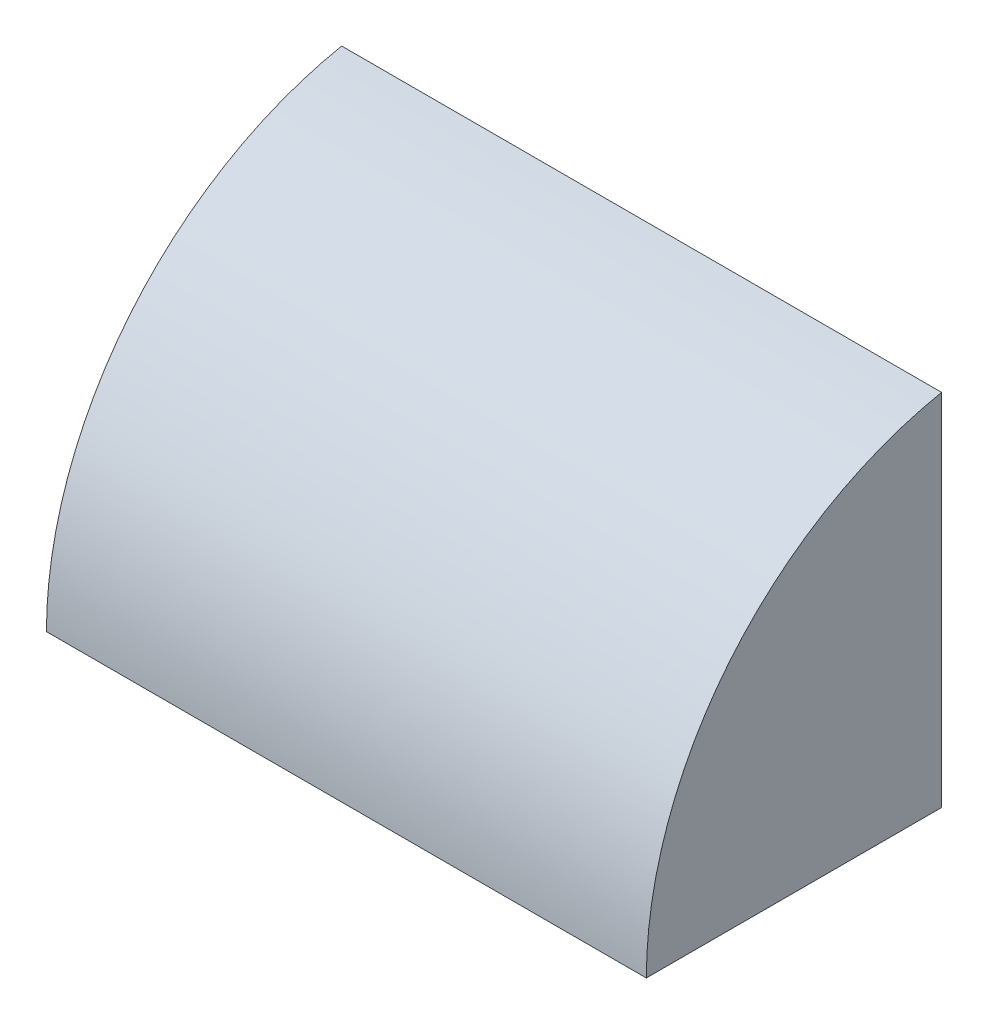
ISO-10303-21;
HEADER;
FILE_DESCRIPTION(('STEP AP214'),'2;1');
FILE_NAME('part.step','',(''),(''),'','','');
FILE_SCHEMA(('AUTOMOTIVE_DESIGN { 1 0 10303 214 1 1 1 1 }'));
ENDSEC;
DATA;
#1=APPLICATION_CONTEXT('core data for automotive mechanical design processes');
#2=APPLICATION_PROTOCOL_DEFINITION('international standard','automotive_design',2000,#1);
#3=PRODUCT_CONTEXT('',#1,'mechanical');
#4=PRODUCT('Part','Part','',(#3));
#5=PRODUCT_RELATED_PRODUCT_CATEGORY('part','',(#4));
#6=PRODUCT_DEFINITION_FORMATION('','',#4);
#7=PRODUCT_DEFINITION_CONTEXT('part definition',#1,'design');
#8=PRODUCT_DEFINITION('design','',#6,#7);
#9=PRODUCT_DEFINITION_SHAPE('','',#8);
#10=(LENGTH_UNIT() NAMED_UNIT(*) SI_UNIT(.MILLI.,.METRE.));
#11=(NAMED_UNIT(*) PLANE_ANGLE_UNIT() SI_UNIT($,.RADIAN.));
#12=(NAMED_UNIT(*) SI_UNIT($,.STERADIAN.) SOLID_ANGLE_UNIT());
#13=UNCERTAINTY_MEASURE_WITH_UNIT(LENGTH_MEASURE(1.E-05),#10,'distance_accuracy_value','');
#14=(GEOMETRIC_REPRESENTATION_CONTEXT(3) GLOBAL_UNCERTAINTY_ASSIGNED_CONTEXT((#13)) GLOBAL_UNIT_ASSIGNED_CONTEXT((#10,
#11,#12)) REPRESENTATION_CONTEXT('',''));
#15=CARTESIAN_POINT('',(0.,0.,0.));
#16=DIRECTION('',(0.,0.,1.));
#17=DIRECTION('',(1.,0.,0.));
#18=AXIS2_PLACEMENT_3D('',#15,#16,#17);
#19=CARTESIAN_POINT('',(-15.85,0.,0.));
#20=DIRECTION('',(0.,-1.,0.));
#21=DIRECTION('',(0.,0.,-1.));
#22=AXIS2_PLACEMENT_3D('',#19,#20,#21);
#23=PLANE('',#22);
#24=DIRECTION('',(0.,0.,-1.));
#25=VECTOR('',#24,1.);
#26=CARTESIAN_POINT('',(0.,0.,0.));
#27=LINE('',#26,#25);
#28=CARTESIAN_POINT('',(0.,0.,7.8));
#29=VERTEX_POINT('',#28);
#30=CARTESIAN_POINT('',(0.,0.,0.));
#31=VERTEX_POINT('',#30);
#32=EDGE_CURVE('E133',#29,#31,#27,.T.);
#33=ORIENTED_EDGE('',*,*,#32,.F.);
#34=DIRECTION('',(1.,0.,0.));
#35=VECTOR('',#34,1.);
#36=CARTESIAN_POINT('',(-15.85,0.,7.8));
#37=LINE('',#36,#35);
#38=CARTESIAN_POINT('',(-15.85,0.,7.8));
#39=VERTEX_POINT('',#38);
#40=EDGE_CURVE('E37',#39,#29,#37,.T.);
#41=ORIENTED_EDGE('',*,*,#40,.F.);
#42=DIRECTION('',(0.,0.,-1.));
#43=VECTOR('',#42,1.);
#44=CARTESIAN_POINT('',(-15.85,0.,0.));
#45=LINE('',#44,#43);
#46=CARTESIAN_POINT('',(-15.85,0.,0.));
#47=VERTEX_POINT('',#46);
#48=EDGE_CURVE('E126',#39,#47,#45,.T.);
#49=ORIENTED_EDGE('',*,*,#48,.T.);
#50=DIRECTION('',(1.,0.,0.));
#51=VECTOR('',#50,1.);
#52=CARTESIAN_POINT('',(-15.85,0.,0.));
#53=LINE('',#52,#51);
#54=EDGE_CURVE('E42',#47,#31,#53,.T.);
#55=ORIENTED_EDGE('',*,*,#54,.T.);
#56=EDGE_LOOP('',(#33,#41,#49,#55));
#57=FACE_BOUND('',#56,.T.);
#58=DIRECTION('',(1.,0.,0.));
#59=VECTOR('',#58,1.);
#60=CARTESIAN_POINT('',(-14.35,0.,6.3));
#61=LINE('',#60,#59);
#62=CARTESIAN_POINT('',(-14.35,0.,6.3));
#63=VERTEX_POINT('',#62);
#64=CARTESIAN_POINT('',(-1.5,0.,6.3));
#65=VERTEX_POINT('',#64);
#66=EDGE_CURVE('E107',#63,#65,#61,.T.);
#67=ORIENTED_EDGE('',*,*,#66,.T.);
#68=DIRECTION('',(0.,0.,-1.));
#69=VECTOR('',#68,1.);
#70=CARTESIAN_POINT('',(-1.5,0.,0.));
#71=LINE('',#70,#69);
#72=CARTESIAN_POINT('',(-1.5,0.,1.5));
#73=VERTEX_POINT('',#72);
#74=EDGE_CURVE('E120',#65,#73,#71,.T.);
#75=ORIENTED_EDGE('',*,*,#74,.T.);
#76=DIRECTION('',(1.,0.,0.));
#77=VECTOR('',#76,1.);
#78=CARTESIAN_POINT('',(-15.85,0.,1.5));
#79=LINE('',#78,#77);
#80=CARTESIAN_POINT('',(-14.35,0.,1.5));
#81=VERTEX_POINT('',#80);
#82=EDGE_CURVE('E101',#81,#73,#79,.T.);
#83=ORIENTED_EDGE('',*,*,#82,.F.);
#84=DIRECTION('',(0.,0.,-1.));
#85=VECTOR('',#84,1.);
#86=CARTESIAN_POINT('',(-14.35,0.,0.));
#87=LINE('',#86,#85);
#88=EDGE_CURVE('E110',#63,#81,#87,.T.);
#89=ORIENTED_EDGE('',*,*,#88,.F.);
#90=EDGE_LOOP('',(#67,#75,#83,#89));
#91=FACE_BOUND('',#90,.T.);
#92=ADVANCED_FACE('F33',(#57,#91),#23,.T.);
#93=CARTESIAN_POINT('',(-15.85,0.,-1.88525641025641));
#94=DIRECTION('',(1.,0.,0.));
#95=DIRECTION('',(0.,0.,-1.));
#96=AXIS2_PLACEMENT_3D('',#93,#94,#95);
#97=CYLINDRICAL_SURFACE('',#96,9.68525641025641);
#98=CARTESIAN_POINT('',(0.,0.,-1.88525641025641));
#99=DIRECTION('',(1.,0.,0.));
#100=DIRECTION('',(0.,0.,1.));
#101=AXIS2_PLACEMENT_3D('',#98,#99,#100);
#102=CIRCLE('',#101,9.68525641025641);
#103=CARTESIAN_POINT('',(0.,9.5,0.));
#104=VERTEX_POINT('',#103);
#105=EDGE_CURVE('E100',#104,#29,#102,.T.);
#106=ORIENTED_EDGE('',*,*,#105,.F.);
#107=DIRECTION('',(1.,0.,0.));
#108=VECTOR('',#107,1.);
#109=CARTESIAN_POINT('',(-15.85,9.5,0.));
#110=LINE('',#109,#108);
#111=CARTESIAN_POINT('',(-15.85,9.5,0.));
#112=VERTEX_POINT('',#111);
#113=EDGE_CURVE('E11',#112,#104,#110,.T.);
#114=ORIENTED_EDGE('',*,*,#113,.F.);
#115=CARTESIAN_POINT('',(-15.85,0.,-1.88525641025641));
#116=DIRECTION('',(1.,0.,0.));
#117=DIRECTION('',(0.,0.,1.));
#118=AXIS2_PLACEMENT_3D('',#115,#116,#117);
#119=CIRCLE('',#118,9.68525641025641);
#120=EDGE_CURVE('E124',#112,#39,#119,.T.);
#121=ORIENTED_EDGE('',*,*,#120,.T.);
#122=ORIENTED_EDGE('',*,*,#40,.T.);
#123=EDGE_LOOP('',(#106,#114,#121,#122));
#124=FACE_BOUND('',#123,.T.);
#125=ADVANCED_FACE('F35',(#124),#97,.T.);
#126=CARTESIAN_POINT('',(-15.85,9.5,0.));
#127=DIRECTION('',(0.,0.,-1.));
#128=DIRECTION('',(-1.,0.,0.));
#129=AXIS2_PLACEMENT_3D('',#126,#127,#128);
#130=PLANE('',#129);
#131=DIRECTION('',(0.,1.,0.));
#132=VECTOR('',#131,1.);
#133=CARTESIAN_POINT('',(0.,9.5,0.));
#134=LINE('',#133,#132);
#135=EDGE_CURVE('E127',#31,#104,#134,.T.);
#136=ORIENTED_EDGE('',*,*,#135,.F.);
#137=ORIENTED_EDGE('',*,*,#54,.F.);
#138=DIRECTION('',(0.,1.,0.));
#139=VECTOR('',#138,1.);
#140=CARTESIAN_POINT('',(-15.85,9.5,0.));
#141=LINE('',#140,#139);
#142=EDGE_CURVE('E129',#47,#112,#141,.T.);
#143=ORIENTED_EDGE('',*,*,#142,.T.);
#144=ORIENTED_EDGE('',*,*,#113,.T.);
#145=EDGE_LOOP('',(#136,#137,#143,#144));
#146=FACE_BOUND('',#145,.T.);
#147=ADVANCED_FACE('F140',(#146),#130,.T.);
#148=CARTESIAN_POINT('',(-15.85,0.,-1.88525641025641));
#149=DIRECTION('',(-1.,0.,0.));
#150=DIRECTION('',(0.,0.,1.));
#151=AXIS2_PLACEMENT_3D('',#148,#149,#150);
#152=PLANE('',#151);
#153=ORIENTED_EDGE('',*,*,#120,.F.);
#154=ORIENTED_EDGE('',*,*,#142,.F.);
#155=ORIENTED_EDGE('',*,*,#48,.F.);
#156=EDGE_LOOP('',(#153,#154,#155));
#157=FACE_BOUND('',#156,.T.);
#158=ADVANCED_FACE('F143',(#157),#152,.T.);
#159=CARTESIAN_POINT('',(0.,0.,-1.88525641025641));
#160=DIRECTION('',(-1.,0.,0.));
#161=DIRECTION('',(0.,0.,1.));
#162=AXIS2_PLACEMENT_3D('',#159,#160,#161);
#163=PLANE('',#162);
#164=ORIENTED_EDGE('',*,*,#105,.T.);
#165=ORIENTED_EDGE('',*,*,#32,.T.);
#166=ORIENTED_EDGE('',*,*,#135,.T.);
#167=EDGE_LOOP('',(#164,#165,#166));
#168=FACE_BOUND('',#167,.T.);
#169=ADVANCED_FACE('F139',(#168),#163,.F.);
#170=CARTESIAN_POINT('',(-15.85,0.,-1.88525641025641));
#171=DIRECTION('',(1.,0.,0.));
#172=DIRECTION('',(0.,0.,-1.));
#173=AXIS2_PLACEMENT_3D('',#170,#171,#172);
#174=CYLINDRICAL_SURFACE('',#173,8.18525641025641);
#175=CARTESIAN_POINT('',(-1.5,0.,-1.88525641025641));
#176=DIRECTION('',(-1.,0.,0.));
#177=DIRECTION('',(0.,0.,1.));
#178=AXIS2_PLACEMENT_3D('',#175,#176,#177);
#179=CIRCLE('',#178,8.18525641025641);
#180=CARTESIAN_POINT('',(-1.5,7.45241313525099,1.5));
#181=VERTEX_POINT('',#180);
#182=EDGE_CURVE('E123',#181,#65,#179,.F.);
#183=ORIENTED_EDGE('',*,*,#182,.T.);
#184=ORIENTED_EDGE('',*,*,#66,.F.);
#185=CARTESIAN_POINT('',(-14.35,0.,-1.88525641025641));
#186=DIRECTION('',(-1.,0.,0.));
#187=DIRECTION('',(0.,0.,1.));
#188=AXIS2_PLACEMENT_3D('',#185,#186,#187);
#189=CIRCLE('',#188,8.18525641025641);
#190=CARTESIAN_POINT('',(-14.35,7.45241313525099,1.5));
#191=VERTEX_POINT('',#190);
#192=EDGE_CURVE('E104',#191,#63,#189,.F.);
#193=ORIENTED_EDGE('',*,*,#192,.F.);
#194=DIRECTION('',(1.,0.,0.));
#195=VECTOR('',#194,1.);
#196=CARTESIAN_POINT('',(-14.35,7.45241313525099,1.5));
#197=LINE('',#196,#195);
#198=EDGE_CURVE('E92',#191,#181,#197,.T.);
#199=ORIENTED_EDGE('',*,*,#198,.T.);
#200=EDGE_LOOP('',(#183,#184,#193,#199));
#201=FACE_BOUND('',#200,.T.);
#202=ADVANCED_FACE('F105',(#201),#174,.F.);
#203=CARTESIAN_POINT('',(-15.85,9.5,1.5));
#204=DIRECTION('',(0.,0.,-1.));
#205=DIRECTION('',(-1.,0.,0.));
#206=AXIS2_PLACEMENT_3D('',#203,#204,#205);
#207=PLANE('',#206);
#208=DIRECTION('',(0.,1.,0.));
#209=VECTOR('',#208,1.);
#210=CARTESIAN_POINT('',(-1.5,9.5,1.5));
#211=LINE('',#210,#209);
#212=EDGE_CURVE('E96',#73,#181,#211,.T.);
#213=ORIENTED_EDGE('',*,*,#212,.T.);
#214=ORIENTED_EDGE('',*,*,#198,.F.);
#215=DIRECTION('',(0.,1.,0.));
#216=VECTOR('',#215,1.);
#217=CARTESIAN_POINT('',(-14.35,9.5,1.5));
#218=LINE('',#217,#216);
#219=EDGE_CURVE('E50',#81,#191,#218,.T.);
#220=ORIENTED_EDGE('',*,*,#219,.F.);
#221=ORIENTED_EDGE('',*,*,#82,.T.);
#222=EDGE_LOOP('',(#213,#214,#220,#221));
#223=FACE_BOUND('',#222,.T.);
#224=ADVANCED_FACE('F94',(#223),#207,.F.);
#225=CARTESIAN_POINT('',(-14.35,0.,-1.88525641025641));
#226=DIRECTION('',(-1.,0.,0.));
#227=DIRECTION('',(0.,0.,1.));
#228=AXIS2_PLACEMENT_3D('',#225,#226,#227);
#229=PLANE('',#228);
#230=ORIENTED_EDGE('',*,*,#192,.T.);
#231=ORIENTED_EDGE('',*,*,#88,.T.);
#232=ORIENTED_EDGE('',*,*,#219,.T.);
#233=EDGE_LOOP('',(#230,#231,#232));
#234=FACE_BOUND('',#233,.T.);
#235=ADVANCED_FACE('F112',(#234),#229,.F.);
#236=CARTESIAN_POINT('',(-1.5,0.,-1.88525641025641));
#237=DIRECTION('',(-1.,0.,0.));
#238=DIRECTION('',(0.,0.,1.));
#239=AXIS2_PLACEMENT_3D('',#236,#237,#238);
#240=PLANE('',#239);
#241=ORIENTED_EDGE('',*,*,#182,.F.);
#242=ORIENTED_EDGE('',*,*,#212,.F.);
#243=ORIENTED_EDGE('',*,*,#74,.F.);
#244=EDGE_LOOP('',(#241,#242,#243));
#245=FACE_BOUND('',#244,.T.);
#246=ADVANCED_FACE('F202',(#245),#240,.T.);
#247=CLOSED_SHELL('',(#92,#125,#147,#158,#169,#202,#224,#235,#246));
#248=MANIFOLD_SOLID_BREP('B2',#247);
#249=ADVANCED_BREP_SHAPE_REPRESENTATION('',(#18,#248),#14);
#250=SHAPE_DEFINITION_REPRESENTATION(#9,#249);
ENDSEC;
END-ISO-10303-21;
